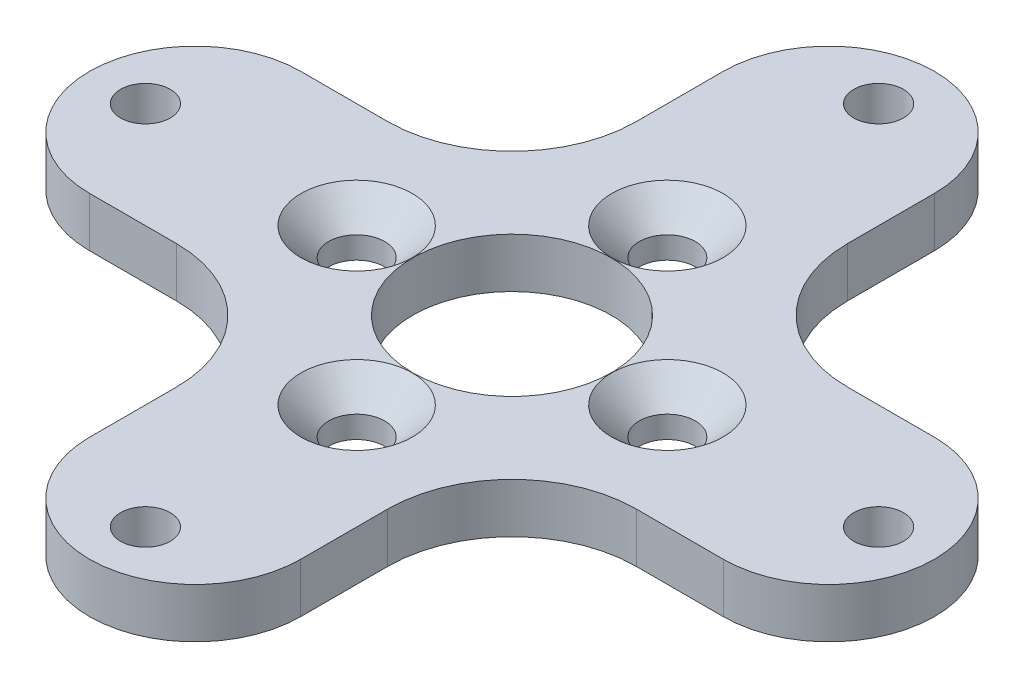
ISO-10303-21;
HEADER;
FILE_DESCRIPTION(('STEP AP214'),'2;1');
FILE_NAME('part.step','',(''),(''),'','','');
FILE_SCHEMA(('AUTOMOTIVE_DESIGN { 1 0 10303 214 1 1 1 1 }'));
ENDSEC;
DATA;
#1=APPLICATION_CONTEXT('core data for automotive mechanical design processes');
#2=APPLICATION_PROTOCOL_DEFINITION('international standard','automotive_design',2000,#1);
#3=PRODUCT_CONTEXT('',#1,'mechanical');
#4=PRODUCT('Part','Part','',(#3));
#5=PRODUCT_RELATED_PRODUCT_CATEGORY('part','',(#4));
#6=PRODUCT_DEFINITION_FORMATION('','',#4);
#7=PRODUCT_DEFINITION_CONTEXT('part definition',#1,'design');
#8=PRODUCT_DEFINITION('design','',#6,#7);
#9=PRODUCT_DEFINITION_SHAPE('','',#8);
#10=(LENGTH_UNIT() NAMED_UNIT(*) SI_UNIT(.MILLI.,.METRE.));
#11=(NAMED_UNIT(*) PLANE_ANGLE_UNIT() SI_UNIT($,.RADIAN.));
#12=(NAMED_UNIT(*) SI_UNIT($,.STERADIAN.) SOLID_ANGLE_UNIT());
#13=UNCERTAINTY_MEASURE_WITH_UNIT(LENGTH_MEASURE(1.E-05),#10,'distance_accuracy_value','');
#14=(GEOMETRIC_REPRESENTATION_CONTEXT(3) GLOBAL_UNCERTAINTY_ASSIGNED_CONTEXT((#13)) GLOBAL_UNIT_ASSIGNED_CONTEXT((#10,
#11,#12)) REPRESENTATION_CONTEXT('',''));
#15=CARTESIAN_POINT('',(0.,0.,0.));
#16=DIRECTION('',(0.,0.,1.));
#17=DIRECTION('',(1.,0.,0.));
#18=AXIS2_PLACEMENT_3D('',#15,#16,#17);
#19=CARTESIAN_POINT('',(0.,2.,-8.50000000000003));
#20=DIRECTION('',(0.,0.,-1.));
#21=DIRECTION('',(-1.,0.,0.));
#22=AXIS2_PLACEMENT_3D('',#19,#20,#21);
#23=PLANE('',#22);
#24=DIRECTION('',(1.,0.,0.));
#25=VECTOR('',#24,1.);
#26=CARTESIAN_POINT('',(0.,2.,-8.50000000000003));
#27=LINE('',#26,#25);
#28=CARTESIAN_POINT('',(-25.5000000000001,2.,-8.50000000000002));
#29=VERTEX_POINT('',#28);
#30=CARTESIAN_POINT('',(-18.5,2.,-8.50000000000002));
#31=VERTEX_POINT('',#30);
#32=EDGE_CURVE('E164',#29,#31,#27,.T.);
#33=ORIENTED_EDGE('',*,*,#32,.T.);
#34=DIRECTION('',(0.,-1.,0.));
#35=VECTOR('',#34,1.);
#36=CARTESIAN_POINT('',(-18.5,2.,-8.50000000000002));
#37=LINE('',#36,#35);
#38=CARTESIAN_POINT('',(-18.5,-2.,-8.50000000000002));
#39=VERTEX_POINT('',#38);
#40=EDGE_CURVE('E170',#31,#39,#37,.T.);
#41=ORIENTED_EDGE('',*,*,#40,.T.);
#42=DIRECTION('',(1.,0.,0.));
#43=VECTOR('',#42,1.);
#44=CARTESIAN_POINT('',(0.,-2.,-8.50000000000003));
#45=LINE('',#44,#43);
#46=CARTESIAN_POINT('',(-25.5000000000001,-2.,-8.50000000000002));
#47=VERTEX_POINT('',#46);
#48=EDGE_CURVE('E167',#47,#39,#45,.T.);
#49=ORIENTED_EDGE('',*,*,#48,.F.);
#50=DIRECTION('',(0.,-1.,0.));
#51=VECTOR('',#50,1.);
#52=CARTESIAN_POINT('',(-25.5000000000001,2.,-8.50000000000002));
#53=LINE('',#52,#51);
#54=EDGE_CURVE('E160',#29,#47,#53,.T.);
#55=ORIENTED_EDGE('',*,*,#54,.F.);
#56=EDGE_LOOP('',(#33,#41,#49,#55));
#57=FACE_BOUND('',#56,.T.);
#58=ADVANCED_FACE('F47',(#57),#23,.T.);
#59=CARTESIAN_POINT('',(-25.5000000000001,2.,0.));
#60=DIRECTION('',(0.,-1.,0.));
#61=DIRECTION('',(0.,0.,-1.));
#62=AXIS2_PLACEMENT_3D('',#59,#60,#61);
#63=CYLINDRICAL_SURFACE('',#62,8.5);
#64=CARTESIAN_POINT('',(-25.5000000000001,-2.,0.));
#65=DIRECTION('',(0.,1.,0.));
#66=DIRECTION('',(0.,0.,1.));
#67=AXIS2_PLACEMENT_3D('',#64,#65,#66);
#68=CIRCLE('',#67,8.5);
#69=CARTESIAN_POINT('',(-25.5000000000001,-2.,8.50000000000002));
#70=VERTEX_POINT('',#69);
#71=EDGE_CURVE('E217',#47,#70,#68,.T.);
#72=ORIENTED_EDGE('',*,*,#71,.T.);
#73=DIRECTION('',(0.,-1.,0.));
#74=VECTOR('',#73,1.);
#75=CARTESIAN_POINT('',(-25.5000000000001,2.,8.50000000000002));
#76=LINE('',#75,#74);
#77=CARTESIAN_POINT('',(-25.5000000000001,2.,8.50000000000002));
#78=VERTEX_POINT('',#77);
#79=EDGE_CURVE('E171',#78,#70,#76,.T.);
#80=ORIENTED_EDGE('',*,*,#79,.F.);
#81=CARTESIAN_POINT('',(-25.5000000000001,2.,0.));
#82=DIRECTION('',(0.,1.,0.));
#83=DIRECTION('',(0.,0.,1.));
#84=AXIS2_PLACEMENT_3D('',#81,#82,#83);
#85=CIRCLE('',#84,8.5);
#86=EDGE_CURVE('E174',#29,#78,#85,.T.);
#87=ORIENTED_EDGE('',*,*,#86,.F.);
#88=ORIENTED_EDGE('',*,*,#54,.T.);
#89=EDGE_LOOP('',(#72,#80,#87,#88));
#90=FACE_BOUND('',#89,.T.);
#91=ADVANCED_FACE('F175',(#90),#63,.T.);
#92=CARTESIAN_POINT('',(0.,2.,8.50000000000002));
#93=DIRECTION('',(0.,0.,-1.));
#94=DIRECTION('',(-1.,0.,0.));
#95=AXIS2_PLACEMENT_3D('',#92,#93,#94);
#96=PLANE('',#95);
#97=DIRECTION('',(1.,0.,0.));
#98=VECTOR('',#97,1.);
#99=CARTESIAN_POINT('',(0.,-2.,8.50000000000002));
#100=LINE('',#99,#98);
#101=CARTESIAN_POINT('',(-18.5,-2.,8.50000000000002));
#102=VERTEX_POINT('',#101);
#103=EDGE_CURVE('E220',#70,#102,#100,.T.);
#104=ORIENTED_EDGE('',*,*,#103,.T.);
#105=DIRECTION('',(0.,-1.,0.));
#106=VECTOR('',#105,1.);
#107=CARTESIAN_POINT('',(-18.5,2.,8.50000000000002));
#108=LINE('',#107,#106);
#109=CARTESIAN_POINT('',(-18.5,2.,8.50000000000002));
#110=VERTEX_POINT('',#109);
#111=EDGE_CURVE('E62',#102,#110,#108,.F.);
#112=ORIENTED_EDGE('',*,*,#111,.T.);
#113=DIRECTION('',(1.,0.,0.));
#114=VECTOR('',#113,1.);
#115=CARTESIAN_POINT('',(0.,2.,8.50000000000002));
#116=LINE('',#115,#114);
#117=EDGE_CURVE('E178',#78,#110,#116,.T.);
#118=ORIENTED_EDGE('',*,*,#117,.F.);
#119=ORIENTED_EDGE('',*,*,#79,.T.);
#120=EDGE_LOOP('',(#104,#112,#118,#119));
#121=FACE_BOUND('',#120,.T.);
#122=ADVANCED_FACE('F313',(#121),#96,.F.);
#123=CARTESIAN_POINT('',(-8.50000000000002,2.,0.));
#124=DIRECTION('',(1.,0.,0.));
#125=DIRECTION('',(0.,0.,-1.));
#126=AXIS2_PLACEMENT_3D('',#123,#124,#125);
#127=PLANE('',#126);
#128=DIRECTION('',(0.,0.,1.));
#129=VECTOR('',#128,1.);
#130=CARTESIAN_POINT('',(-8.50000000000002,2.,0.));
#131=LINE('',#130,#129);
#132=CARTESIAN_POINT('',(-8.50000000000002,2.,18.5));
#133=VERTEX_POINT('',#132);
#134=CARTESIAN_POINT('',(-8.50000000000002,2.,25.5000000000001));
#135=VERTEX_POINT('',#134);
#136=EDGE_CURVE('E194',#133,#135,#131,.T.);
#137=ORIENTED_EDGE('',*,*,#136,.F.);
#138=DIRECTION('',(0.,-1.,0.));
#139=VECTOR('',#138,1.);
#140=CARTESIAN_POINT('',(-8.50000000000002,-2.,18.5));
#141=LINE('',#140,#139);
#142=CARTESIAN_POINT('',(-8.50000000000002,-2.,18.5));
#143=VERTEX_POINT('',#142);
#144=EDGE_CURVE('E270',#133,#143,#141,.T.);
#145=ORIENTED_EDGE('',*,*,#144,.T.);
#146=DIRECTION('',(0.,0.,1.));
#147=VECTOR('',#146,1.);
#148=CARTESIAN_POINT('',(-8.50000000000002,-2.,0.));
#149=LINE('',#148,#147);
#150=CARTESIAN_POINT('',(-8.50000000000002,-2.,25.5000000000001));
#151=VERTEX_POINT('',#150);
#152=EDGE_CURVE('E222',#143,#151,#149,.T.);
#153=ORIENTED_EDGE('',*,*,#152,.T.);
#154=DIRECTION('',(0.,-1.,0.));
#155=VECTOR('',#154,1.);
#156=CARTESIAN_POINT('',(-8.50000000000002,2.,25.5000000000001));
#157=LINE('',#156,#155);
#158=EDGE_CURVE('E253',#135,#151,#157,.T.);
#159=ORIENTED_EDGE('',*,*,#158,.F.);
#160=EDGE_LOOP('',(#137,#145,#153,#159));
#161=FACE_BOUND('',#160,.T.);
#162=ADVANCED_FACE('F309',(#161),#127,.F.);
#163=CARTESIAN_POINT('',(0.,2.,25.5000000000001));
#164=DIRECTION('',(0.,-1.,0.));
#165=DIRECTION('',(0.,0.,-1.));
#166=AXIS2_PLACEMENT_3D('',#163,#164,#165);
#167=CYLINDRICAL_SURFACE('',#166,8.5);
#168=CARTESIAN_POINT('',(0.,-2.,25.5000000000001));
#169=DIRECTION('',(0.,1.,0.));
#170=DIRECTION('',(0.,0.,1.));
#171=AXIS2_PLACEMENT_3D('',#168,#169,#170);
#172=CIRCLE('',#171,8.5);
#173=CARTESIAN_POINT('',(8.50000000000002,-2.,25.5000000000001));
#174=VERTEX_POINT('',#173);
#175=EDGE_CURVE('E224',#151,#174,#172,.T.);
#176=ORIENTED_EDGE('',*,*,#175,.T.);
#177=DIRECTION('',(0.,-1.,0.));
#178=VECTOR('',#177,1.);
#179=CARTESIAN_POINT('',(8.50000000000002,2.,25.5000000000001));
#180=LINE('',#179,#178);
#181=CARTESIAN_POINT('',(8.50000000000002,2.,25.5000000000001));
#182=VERTEX_POINT('',#181);
#183=EDGE_CURVE('E250',#182,#174,#180,.T.);
#184=ORIENTED_EDGE('',*,*,#183,.F.);
#185=CARTESIAN_POINT('',(0.,2.,25.5000000000001));
#186=DIRECTION('',(0.,1.,0.));
#187=DIRECTION('',(0.,0.,1.));
#188=AXIS2_PLACEMENT_3D('',#185,#186,#187);
#189=CIRCLE('',#188,8.5);
#190=EDGE_CURVE('E196',#135,#182,#189,.T.);
#191=ORIENTED_EDGE('',*,*,#190,.F.);
#192=ORIENTED_EDGE('',*,*,#158,.T.);
#193=EDGE_LOOP('',(#176,#184,#191,#192));
#194=FACE_BOUND('',#193,.T.);
#195=ADVANCED_FACE('F305',(#194),#167,.T.);
#196=CARTESIAN_POINT('',(8.50000000000002,2.,0.));
#197=DIRECTION('',(1.,0.,0.));
#198=DIRECTION('',(0.,0.,-1.));
#199=AXIS2_PLACEMENT_3D('',#196,#197,#198);
#200=PLANE('',#199);
#201=DIRECTION('',(0.,0.,1.));
#202=VECTOR('',#201,1.);
#203=CARTESIAN_POINT('',(8.50000000000002,-2.,0.));
#204=LINE('',#203,#202);
#205=CARTESIAN_POINT('',(8.50000000000002,-2.,18.5));
#206=VERTEX_POINT('',#205);
#207=EDGE_CURVE('E227',#206,#174,#204,.T.);
#208=ORIENTED_EDGE('',*,*,#207,.F.);
#209=DIRECTION('',(0.,-1.,0.));
#210=VECTOR('',#209,1.);
#211=CARTESIAN_POINT('',(8.50000000000002,2.,18.5));
#212=LINE('',#211,#210);
#213=CARTESIAN_POINT('',(8.50000000000002,2.,18.5));
#214=VERTEX_POINT('',#213);
#215=EDGE_CURVE('E268',#206,#214,#212,.F.);
#216=ORIENTED_EDGE('',*,*,#215,.T.);
#217=DIRECTION('',(0.,0.,1.));
#218=VECTOR('',#217,1.);
#219=CARTESIAN_POINT('',(8.50000000000002,2.,0.));
#220=LINE('',#219,#218);
#221=EDGE_CURVE('E199',#214,#182,#220,.T.);
#222=ORIENTED_EDGE('',*,*,#221,.T.);
#223=ORIENTED_EDGE('',*,*,#183,.T.);
#224=EDGE_LOOP('',(#208,#216,#222,#223));
#225=FACE_BOUND('',#224,.T.);
#226=ADVANCED_FACE('F301',(#225),#200,.T.);
#227=CARTESIAN_POINT('',(0.,2.,8.50000000000002));
#228=DIRECTION('',(0.,0.,-1.));
#229=DIRECTION('',(-1.,0.,0.));
#230=AXIS2_PLACEMENT_3D('',#227,#228,#229);
#231=PLANE('',#230);
#232=DIRECTION('',(1.,0.,0.));
#233=VECTOR('',#232,1.);
#234=CARTESIAN_POINT('',(0.,2.,8.50000000000002));
#235=LINE('',#234,#233);
#236=CARTESIAN_POINT('',(18.5,2.,8.50000000000002));
#237=VERTEX_POINT('',#236);
#238=CARTESIAN_POINT('',(25.5000000000001,2.,8.50000000000002));
#239=VERTEX_POINT('',#238);
#240=EDGE_CURVE('E201',#237,#239,#235,.T.);
#241=ORIENTED_EDGE('',*,*,#240,.F.);
#242=DIRECTION('',(0.,-1.,0.));
#243=VECTOR('',#242,1.);
#244=CARTESIAN_POINT('',(18.5,2.,8.50000000000002));
#245=LINE('',#244,#243);
#246=CARTESIAN_POINT('',(18.5,-2.,8.50000000000002));
#247=VERTEX_POINT('',#246);
#248=EDGE_CURVE('E265',#237,#247,#245,.T.);
#249=ORIENTED_EDGE('',*,*,#248,.T.);
#250=DIRECTION('',(1.,0.,0.));
#251=VECTOR('',#250,1.);
#252=CARTESIAN_POINT('',(0.,-2.,8.50000000000002));
#253=LINE('',#252,#251);
#254=CARTESIAN_POINT('',(25.5000000000001,-2.,8.50000000000002));
#255=VERTEX_POINT('',#254);
#256=EDGE_CURVE('E229',#247,#255,#253,.T.);
#257=ORIENTED_EDGE('',*,*,#256,.T.);
#258=DIRECTION('',(0.,-1.,0.));
#259=VECTOR('',#258,1.);
#260=CARTESIAN_POINT('',(25.5000000000001,2.,8.50000000000002));
#261=LINE('',#260,#259);
#262=EDGE_CURVE('E247',#239,#255,#261,.T.);
#263=ORIENTED_EDGE('',*,*,#262,.F.);
#264=EDGE_LOOP('',(#241,#249,#257,#263));
#265=FACE_BOUND('',#264,.T.);
#266=ADVANCED_FACE('F292',(#265),#231,.F.);
#267=CARTESIAN_POINT('',(25.5000000000001,2.,0.));
#268=DIRECTION('',(0.,-1.,0.));
#269=DIRECTION('',(0.,0.,-1.));
#270=AXIS2_PLACEMENT_3D('',#267,#268,#269);
#271=CYLINDRICAL_SURFACE('',#270,8.5);
#272=CARTESIAN_POINT('',(25.5000000000001,-2.,0.));
#273=DIRECTION('',(0.,1.,0.));
#274=DIRECTION('',(0.,0.,1.));
#275=AXIS2_PLACEMENT_3D('',#272,#273,#274);
#276=CIRCLE('',#275,8.5);
#277=CARTESIAN_POINT('',(25.5000000000001,-2.,-8.50000000000003));
#278=VERTEX_POINT('',#277);
#279=EDGE_CURVE('E231',#255,#278,#276,.T.);
#280=ORIENTED_EDGE('',*,*,#279,.T.);
#281=DIRECTION('',(0.,-1.,0.));
#282=VECTOR('',#281,1.);
#283=CARTESIAN_POINT('',(25.5000000000001,2.,-8.50000000000003));
#284=LINE('',#283,#282);
#285=CARTESIAN_POINT('',(25.5000000000001,2.,-8.50000000000003));
#286=VERTEX_POINT('',#285);
#287=EDGE_CURVE('E244',#286,#278,#284,.T.);
#288=ORIENTED_EDGE('',*,*,#287,.F.);
#289=CARTESIAN_POINT('',(25.5000000000001,2.,0.));
#290=DIRECTION('',(0.,1.,0.));
#291=DIRECTION('',(0.,0.,1.));
#292=AXIS2_PLACEMENT_3D('',#289,#290,#291);
#293=CIRCLE('',#292,8.5);
#294=EDGE_CURVE('E203',#239,#286,#293,.T.);
#295=ORIENTED_EDGE('',*,*,#294,.F.);
#296=ORIENTED_EDGE('',*,*,#262,.T.);
#297=EDGE_LOOP('',(#280,#288,#295,#296));
#298=FACE_BOUND('',#297,.T.);
#299=ADVANCED_FACE('F351',(#298),#271,.T.);
#300=CARTESIAN_POINT('',(0.,2.,-8.50000000000003));
#301=DIRECTION('',(0.,0.,-1.));
#302=DIRECTION('',(-1.,0.,0.));
#303=AXIS2_PLACEMENT_3D('',#300,#301,#302);
#304=PLANE('',#303);
#305=DIRECTION('',(1.,0.,0.));
#306=VECTOR('',#305,1.);
#307=CARTESIAN_POINT('',(0.,-2.,-8.50000000000003));
#308=LINE('',#307,#306);
#309=CARTESIAN_POINT('',(18.5,-2.,-8.50000000000003));
#310=VERTEX_POINT('',#309);
#311=EDGE_CURVE('E234',#310,#278,#308,.T.);
#312=ORIENTED_EDGE('',*,*,#311,.F.);
#313=DIRECTION('',(0.,-1.,0.));
#314=VECTOR('',#313,1.);
#315=CARTESIAN_POINT('',(18.5,2.,-8.50000000000003));
#316=LINE('',#315,#314);
#317=CARTESIAN_POINT('',(18.5,2.,-8.50000000000003));
#318=VERTEX_POINT('',#317);
#319=EDGE_CURVE('E263',#310,#318,#316,.F.);
#320=ORIENTED_EDGE('',*,*,#319,.T.);
#321=DIRECTION('',(1.,0.,0.));
#322=VECTOR('',#321,1.);
#323=CARTESIAN_POINT('',(0.,2.,-8.50000000000003));
#324=LINE('',#323,#322);
#325=EDGE_CURVE('E206',#318,#286,#324,.T.);
#326=ORIENTED_EDGE('',*,*,#325,.T.);
#327=ORIENTED_EDGE('',*,*,#287,.T.);
#328=EDGE_LOOP('',(#312,#320,#326,#327));
#329=FACE_BOUND('',#328,.T.);
#330=ADVANCED_FACE('F354',(#329),#304,.T.);
#331=CARTESIAN_POINT('',(8.50000000000002,2.,0.));
#332=DIRECTION('',(1.,0.,0.));
#333=DIRECTION('',(0.,0.,-1.));
#334=AXIS2_PLACEMENT_3D('',#331,#332,#333);
#335=PLANE('',#334);
#336=DIRECTION('',(0.,0.,1.));
#337=VECTOR('',#336,1.);
#338=CARTESIAN_POINT('',(8.50000000000002,2.,0.));
#339=LINE('',#338,#337);
#340=CARTESIAN_POINT('',(8.50000000000002,2.,-25.5000000000001));
#341=VERTEX_POINT('',#340);
#342=CARTESIAN_POINT('',(8.50000000000002,2.,-18.5000000000001));
#343=VERTEX_POINT('',#342);
#344=EDGE_CURVE('E208',#341,#343,#339,.T.);
#345=ORIENTED_EDGE('',*,*,#344,.T.);
#346=DIRECTION('',(0.,-1.,0.));
#347=VECTOR('',#346,1.);
#348=CARTESIAN_POINT('',(8.50000000000002,-2.,-18.5000000000001));
#349=LINE('',#348,#347);
#350=CARTESIAN_POINT('',(8.50000000000002,-2.,-18.5000000000001));
#351=VERTEX_POINT('',#350);
#352=EDGE_CURVE('E260',#343,#351,#349,.T.);
#353=ORIENTED_EDGE('',*,*,#352,.T.);
#354=DIRECTION('',(0.,0.,1.));
#355=VECTOR('',#354,1.);
#356=CARTESIAN_POINT('',(8.50000000000002,-2.,0.));
#357=LINE('',#356,#355);
#358=CARTESIAN_POINT('',(8.50000000000002,-2.,-25.5000000000001));
#359=VERTEX_POINT('',#358);
#360=EDGE_CURVE('E236',#359,#351,#357,.T.);
#361=ORIENTED_EDGE('',*,*,#360,.F.);
#362=DIRECTION('',(0.,-1.,0.));
#363=VECTOR('',#362,1.);
#364=CARTESIAN_POINT('',(8.50000000000002,2.,-25.5000000000001));
#365=LINE('',#364,#363);
#366=EDGE_CURVE('E242',#341,#359,#365,.T.);
#367=ORIENTED_EDGE('',*,*,#366,.F.);
#368=EDGE_LOOP('',(#345,#353,#361,#367));
#369=FACE_BOUND('',#368,.T.);
#370=ADVANCED_FACE('F358',(#369),#335,.T.);
#371=CARTESIAN_POINT('',(0.,2.,-25.5000000000001));
#372=DIRECTION('',(0.,-1.,0.));
#373=DIRECTION('',(0.,0.,-1.));
#374=AXIS2_PLACEMENT_3D('',#371,#372,#373);
#375=CYLINDRICAL_SURFACE('',#374,8.5);
#376=CARTESIAN_POINT('',(0.,-2.,-25.5000000000001));
#377=DIRECTION('',(0.,1.,0.));
#378=DIRECTION('',(0.,0.,1.));
#379=AXIS2_PLACEMENT_3D('',#376,#377,#378);
#380=CIRCLE('',#379,8.5);
#381=CARTESIAN_POINT('',(-8.50000000000002,-2.,-25.5000000000001));
#382=VERTEX_POINT('',#381);
#383=EDGE_CURVE('E187',#359,#382,#380,.T.);
#384=ORIENTED_EDGE('',*,*,#383,.T.);
#385=DIRECTION('',(0.,-1.,0.));
#386=VECTOR('',#385,1.);
#387=CARTESIAN_POINT('',(-8.50000000000002,2.,-25.5000000000001));
#388=LINE('',#387,#386);
#389=CARTESIAN_POINT('',(-8.50000000000002,2.,-25.5000000000001));
#390=VERTEX_POINT('',#389);
#391=EDGE_CURVE('E215',#390,#382,#388,.T.);
#392=ORIENTED_EDGE('',*,*,#391,.F.);
#393=CARTESIAN_POINT('',(0.,2.,-25.5000000000001));
#394=DIRECTION('',(0.,1.,0.));
#395=DIRECTION('',(0.,0.,1.));
#396=AXIS2_PLACEMENT_3D('',#393,#394,#395);
#397=CIRCLE('',#396,8.5);
#398=EDGE_CURVE('E211',#341,#390,#397,.T.);
#399=ORIENTED_EDGE('',*,*,#398,.F.);
#400=ORIENTED_EDGE('',*,*,#366,.T.);
#401=EDGE_LOOP('',(#384,#392,#399,#400));
#402=FACE_BOUND('',#401,.T.);
#403=ADVANCED_FACE('F362',(#402),#375,.T.);
#404=CARTESIAN_POINT('',(-8.50000000000002,2.,0.));
#405=DIRECTION('',(1.,0.,0.));
#406=DIRECTION('',(0.,0.,-1.));
#407=AXIS2_PLACEMENT_3D('',#404,#405,#406);
#408=PLANE('',#407);
#409=DIRECTION('',(0.,0.,1.));
#410=VECTOR('',#409,1.);
#411=CARTESIAN_POINT('',(-8.50000000000002,-2.,0.));
#412=LINE('',#411,#410);
#413=CARTESIAN_POINT('',(-8.50000000000002,-2.,-18.5));
#414=VERTEX_POINT('',#413);
#415=EDGE_CURVE('E184',#382,#414,#412,.T.);
#416=ORIENTED_EDGE('',*,*,#415,.T.);
#417=DIRECTION('',(0.,-1.,0.));
#418=VECTOR('',#417,1.);
#419=CARTESIAN_POINT('',(-8.50000000000002,2.,-18.5));
#420=LINE('',#419,#418);
#421=CARTESIAN_POINT('',(-8.50000000000002,2.,-18.5));
#422=VERTEX_POINT('',#421);
#423=EDGE_CURVE('E258',#414,#422,#420,.F.);
#424=ORIENTED_EDGE('',*,*,#423,.T.);
#425=DIRECTION('',(0.,0.,1.));
#426=VECTOR('',#425,1.);
#427=CARTESIAN_POINT('',(-8.50000000000002,2.,0.));
#428=LINE('',#427,#426);
#429=EDGE_CURVE('E213',#390,#422,#428,.T.);
#430=ORIENTED_EDGE('',*,*,#429,.F.);
#431=ORIENTED_EDGE('',*,*,#391,.T.);
#432=EDGE_LOOP('',(#416,#424,#430,#431));
#433=FACE_BOUND('',#432,.T.);
#434=ADVANCED_FACE('F319',(#433),#408,.F.);
#435=CARTESIAN_POINT('',(0.,2.,0.));
#436=DIRECTION('',(0.,1.,0.));
#437=DIRECTION('',(0.,0.,1.));
#438=AXIS2_PLACEMENT_3D('',#435,#436,#437);
#439=PLANE('',#438);
#440=CARTESIAN_POINT('',(-12.5,2.,0.));
#441=DIRECTION('',(0.,1.,0.));
#442=DIRECTION('',(0.,0.,1.));
#443=AXIS2_PLACEMENT_3D('',#440,#441,#442);
#444=CIRCLE('',#443,4.48);
#445=CARTESIAN_POINT('',(-12.5,2.,4.48000000000002));
#446=VERTEX_POINT('',#445);
#447=EDGE_CURVE('E431',#446,#446,#444,.T.);
#448=ORIENTED_EDGE('',*,*,#447,.F.);
#449=EDGE_LOOP('',(#448));
#450=FACE_BOUND('',#449,.T.);
#451=CARTESIAN_POINT('',(0.,2.,-12.5));
#452=DIRECTION('',(0.,1.,0.));
#453=DIRECTION('',(0.,0.,1.));
#454=AXIS2_PLACEMENT_3D('',#451,#452,#453);
#455=CIRCLE('',#454,4.48);
#456=CARTESIAN_POINT('',(0.,2.,-8.02000000000003));
#457=VERTEX_POINT('',#456);
#458=EDGE_CURVE('E438',#457,#457,#455,.T.);
#459=ORIENTED_EDGE('',*,*,#458,.F.);
#460=EDGE_LOOP('',(#459));
#461=FACE_BOUND('',#460,.T.);
#462=CARTESIAN_POINT('',(12.5,2.,0.));
#463=DIRECTION('',(0.,1.,0.));
#464=DIRECTION('',(0.,0.,1.));
#465=AXIS2_PLACEMENT_3D('',#462,#463,#464);
#466=CIRCLE('',#465,4.48);
#467=CARTESIAN_POINT('',(12.5,2.,4.48000000000002));
#468=VERTEX_POINT('',#467);
#469=EDGE_CURVE('E447',#468,#468,#466,.T.);
#470=ORIENTED_EDGE('',*,*,#469,.F.);
#471=EDGE_LOOP('',(#470));
#472=FACE_BOUND('',#471,.T.);
#473=CARTESIAN_POINT('',(0.,2.,12.5));
#474=DIRECTION('',(0.,1.,0.));
#475=DIRECTION('',(0.,0.,1.));
#476=AXIS2_PLACEMENT_3D('',#473,#474,#475);
#477=CIRCLE('',#476,4.48);
#478=CARTESIAN_POINT('',(0.,2.,16.9800000000001));
#479=VERTEX_POINT('',#478);
#480=EDGE_CURVE('E456',#479,#479,#477,.T.);
#481=ORIENTED_EDGE('',*,*,#480,.F.);
#482=EDGE_LOOP('',(#481));
#483=FACE_BOUND('',#482,.T.);
#484=CARTESIAN_POINT('',(29.5000000000001,2.,-3.06503954161652E-13));
#485=DIRECTION('',(0.,1.,0.));
#486=DIRECTION('',(-1.,0.,0.));
#487=AXIS2_PLACEMENT_3D('',#484,#485,#486);
#488=CIRCLE('',#487,2.);
#489=CARTESIAN_POINT('',(27.5000000000001,2.,-2.85555066128593E-13));
#490=VERTEX_POINT('',#489);
#491=EDGE_CURVE('E465',#490,#490,#488,.T.);
#492=ORIENTED_EDGE('',*,*,#491,.F.);
#493=EDGE_LOOP('',(#492));
#494=FACE_BOUND('',#493,.T.);
#495=CARTESIAN_POINT('',(-29.5000000000001,2.,1.00505541389406E-13));
#496=DIRECTION('',(0.,1.,0.));
#497=DIRECTION('',(1.,0.,0.));
#498=AXIS2_PLACEMENT_3D('',#495,#496,#497);
#499=CIRCLE('',#498,2.);
#500=CARTESIAN_POINT('',(-27.5000000000001,2.,0.));
#501=VERTEX_POINT('',#500);
#502=EDGE_CURVE('E469',#501,#501,#499,.T.);
#503=ORIENTED_EDGE('',*,*,#502,.F.);
#504=EDGE_LOOP('',(#503));
#505=FACE_BOUND('',#504,.T.);
#506=CARTESIAN_POINT('',(0.,2.,29.5000000000001));
#507=DIRECTION('',(0.,1.,0.));
#508=DIRECTION('',(0.,0.,-1.));
#509=AXIS2_PLACEMENT_3D('',#506,#507,#508);
#510=CIRCLE('',#509,2.);
#511=CARTESIAN_POINT('',(0.,2.,27.5000000000001));
#512=VERTEX_POINT('',#511);
#513=EDGE_CURVE('E470',#512,#512,#510,.T.);
#514=ORIENTED_EDGE('',*,*,#513,.F.);
#515=EDGE_LOOP('',(#514));
#516=FACE_BOUND('',#515,.T.);
#517=CARTESIAN_POINT('',(0.,2.,0.));
#518=DIRECTION('',(0.,1.,0.));
#519=DIRECTION('',(0.,0.,1.));
#520=AXIS2_PLACEMENT_3D('',#517,#518,#519);
#521=CIRCLE('',#520,8.);
#522=CARTESIAN_POINT('',(0.,2.,8.00000000000002));
#523=VERTEX_POINT('',#522);
#524=EDGE_CURVE('E485',#523,#523,#521,.T.);
#525=ORIENTED_EDGE('',*,*,#524,.F.);
#526=EDGE_LOOP('',(#525));
#527=FACE_BOUND('',#526,.T.);
#528=CARTESIAN_POINT('',(0.,2.,-29.5000000000001));
#529=DIRECTION('',(0.,1.,0.));
#530=DIRECTION('',(0.,0.,1.));
#531=AXIS2_PLACEMENT_3D('',#528,#529,#530);
#532=CIRCLE('',#531,2.);
#533=CARTESIAN_POINT('',(0.,2.,-27.5000000000001));
#534=VERTEX_POINT('',#533);
#535=EDGE_CURVE('E190',#534,#534,#532,.T.);
#536=ORIENTED_EDGE('',*,*,#535,.F.);
#537=EDGE_LOOP('',(#536));
#538=FACE_BOUND('',#537,.T.);
#539=ORIENTED_EDGE('',*,*,#32,.F.);
#540=ORIENTED_EDGE('',*,*,#86,.T.);
#541=ORIENTED_EDGE('',*,*,#117,.T.);
#542=CARTESIAN_POINT('',(-18.5,2.,18.5));
#543=DIRECTION('',(0.,1.,0.));
#544=DIRECTION('',(0.,0.,1.));
#545=AXIS2_PLACEMENT_3D('',#542,#543,#544);
#546=CIRCLE('',#545,10.);
#547=EDGE_CURVE('E13',#110,#133,#546,.F.);
#548=ORIENTED_EDGE('',*,*,#547,.T.);
#549=ORIENTED_EDGE('',*,*,#136,.T.);
#550=ORIENTED_EDGE('',*,*,#190,.T.);
#551=ORIENTED_EDGE('',*,*,#221,.F.);
#552=CARTESIAN_POINT('',(18.5,2.,18.5));
#553=DIRECTION('',(0.,1.,0.));
#554=DIRECTION('',(0.,0.,1.));
#555=AXIS2_PLACEMENT_3D('',#552,#553,#554);
#556=CIRCLE('',#555,10.);
#557=EDGE_CURVE('E283',#214,#237,#556,.F.);
#558=ORIENTED_EDGE('',*,*,#557,.T.);
#559=ORIENTED_EDGE('',*,*,#240,.T.);
#560=ORIENTED_EDGE('',*,*,#294,.T.);
#561=ORIENTED_EDGE('',*,*,#325,.F.);
#562=CARTESIAN_POINT('',(18.5,2.,-18.5000000000001));
#563=DIRECTION('',(0.,1.,0.));
#564=DIRECTION('',(0.,0.,1.));
#565=AXIS2_PLACEMENT_3D('',#562,#563,#564);
#566=CIRCLE('',#565,10.);
#567=EDGE_CURVE('E279',#318,#343,#566,.F.);
#568=ORIENTED_EDGE('',*,*,#567,.T.);
#569=ORIENTED_EDGE('',*,*,#344,.F.);
#570=ORIENTED_EDGE('',*,*,#398,.T.);
#571=ORIENTED_EDGE('',*,*,#429,.T.);
#572=CARTESIAN_POINT('',(-18.5,2.,-18.5));
#573=DIRECTION('',(0.,1.,0.));
#574=DIRECTION('',(0.,0.,1.));
#575=AXIS2_PLACEMENT_3D('',#572,#573,#574);
#576=CIRCLE('',#575,10.);
#577=EDGE_CURVE('E183',#422,#31,#576,.F.);
#578=ORIENTED_EDGE('',*,*,#577,.T.);
#579=EDGE_LOOP('',(#539,#540,#541,#548,#549,#550,#551,#558,#559,#560,#561,#568,#569,#570,#571,#578));
#580=FACE_BOUND('',#579,.T.);
#581=ADVANCED_FACE('F180',(#450,#461,#472,#483,#494,#505,#516,#527,#538,#580),#439,.T.);
#582=CARTESIAN_POINT('',(0.,-2.,0.));
#583=DIRECTION('',(0.,1.,0.));
#584=DIRECTION('',(0.,0.,1.));
#585=AXIS2_PLACEMENT_3D('',#582,#583,#584);
#586=PLANE('',#585);
#587=CARTESIAN_POINT('',(-12.5,-2.,0.));
#588=DIRECTION('',(0.,1.,0.));
#589=DIRECTION('',(0.,0.,1.));
#590=AXIS2_PLACEMENT_3D('',#587,#588,#589);
#591=CIRCLE('',#590,2.25);
#592=CARTESIAN_POINT('',(-12.5,-2.,2.25));
#593=VERTEX_POINT('',#592);
#594=EDGE_CURVE('E433',#593,#593,#591,.T.);
#595=ORIENTED_EDGE('',*,*,#594,.T.);
#596=EDGE_LOOP('',(#595));
#597=FACE_BOUND('',#596,.T.);
#598=CARTESIAN_POINT('',(0.,-2.,-12.5));
#599=DIRECTION('',(0.,1.,0.));
#600=DIRECTION('',(0.,0.,1.));
#601=AXIS2_PLACEMENT_3D('',#598,#599,#600);
#602=CIRCLE('',#601,2.25);
#603=CARTESIAN_POINT('',(0.,-2.,-10.25));
#604=VERTEX_POINT('',#603);
#605=EDGE_CURVE('E444',#604,#604,#602,.T.);
#606=ORIENTED_EDGE('',*,*,#605,.T.);
#607=EDGE_LOOP('',(#606));
#608=FACE_BOUND('',#607,.T.);
#609=CARTESIAN_POINT('',(12.5,-2.,0.));
#610=DIRECTION('',(0.,1.,0.));
#611=DIRECTION('',(0.,0.,1.));
#612=AXIS2_PLACEMENT_3D('',#609,#610,#611);
#613=CIRCLE('',#612,2.25);
#614=CARTESIAN_POINT('',(12.5,-2.,2.25));
#615=VERTEX_POINT('',#614);
#616=EDGE_CURVE('E453',#615,#615,#613,.T.);
#617=ORIENTED_EDGE('',*,*,#616,.T.);
#618=EDGE_LOOP('',(#617));
#619=FACE_BOUND('',#618,.T.);
#620=CARTESIAN_POINT('',(0.,-2.,12.5));
#621=DIRECTION('',(0.,1.,0.));
#622=DIRECTION('',(0.,0.,1.));
#623=AXIS2_PLACEMENT_3D('',#620,#621,#622);
#624=CIRCLE('',#623,2.25);
#625=CARTESIAN_POINT('',(0.,-2.,14.7500000000001));
#626=VERTEX_POINT('',#625);
#627=EDGE_CURVE('E462',#626,#626,#624,.T.);
#628=ORIENTED_EDGE('',*,*,#627,.T.);
#629=EDGE_LOOP('',(#628));
#630=FACE_BOUND('',#629,.T.);
#631=CARTESIAN_POINT('',(29.5000000000001,-2.,-3.06503954161652E-13));
#632=DIRECTION('',(0.,1.,0.));
#633=DIRECTION('',(-1.,0.,0.));
#634=AXIS2_PLACEMENT_3D('',#631,#632,#633);
#635=CIRCLE('',#634,2.);
#636=CARTESIAN_POINT('',(27.5000000000001,-2.,-2.85555066128593E-13));
#637=VERTEX_POINT('',#636);
#638=EDGE_CURVE('E473',#637,#637,#635,.T.);
#639=ORIENTED_EDGE('',*,*,#638,.T.);
#640=EDGE_LOOP('',(#639));
#641=FACE_BOUND('',#640,.T.);
#642=CARTESIAN_POINT('',(-29.5000000000001,-2.,1.00505541389406E-13));
#643=DIRECTION('',(0.,1.,0.));
#644=DIRECTION('',(1.,0.,0.));
#645=AXIS2_PLACEMENT_3D('',#642,#643,#644);
#646=CIRCLE('',#645,2.);
#647=CARTESIAN_POINT('',(-27.5000000000001,-2.,0.));
#648=VERTEX_POINT('',#647);
#649=EDGE_CURVE('E474',#648,#648,#646,.T.);
#650=ORIENTED_EDGE('',*,*,#649,.T.);
#651=EDGE_LOOP('',(#650));
#652=FACE_BOUND('',#651,.T.);
#653=CARTESIAN_POINT('',(0.,-2.,29.5000000000001));
#654=DIRECTION('',(0.,1.,0.));
#655=DIRECTION('',(0.,0.,-1.));
#656=AXIS2_PLACEMENT_3D('',#653,#654,#655);
#657=CIRCLE('',#656,2.);
#658=CARTESIAN_POINT('',(0.,-2.,27.5000000000001));
#659=VERTEX_POINT('',#658);
#660=EDGE_CURVE('E466',#659,#659,#657,.T.);
#661=ORIENTED_EDGE('',*,*,#660,.T.);
#662=EDGE_LOOP('',(#661));
#663=FACE_BOUND('',#662,.T.);
#664=CARTESIAN_POINT('',(0.,-2.,0.));
#665=DIRECTION('',(0.,1.,0.));
#666=DIRECTION('',(0.,0.,1.));
#667=AXIS2_PLACEMENT_3D('',#664,#665,#666);
#668=CIRCLE('',#667,8.);
#669=CARTESIAN_POINT('',(0.,-2.,8.00000000000002));
#670=VERTEX_POINT('',#669);
#671=EDGE_CURVE('E218',#670,#670,#668,.T.);
#672=ORIENTED_EDGE('',*,*,#671,.T.);
#673=EDGE_LOOP('',(#672));
#674=FACE_BOUND('',#673,.T.);
#675=CARTESIAN_POINT('',(0.,-2.,-29.5000000000001));
#676=DIRECTION('',(0.,1.,0.));
#677=DIRECTION('',(0.,0.,1.));
#678=AXIS2_PLACEMENT_3D('',#675,#676,#677);
#679=CIRCLE('',#678,2.);
#680=CARTESIAN_POINT('',(0.,-2.,-27.5000000000001));
#681=VERTEX_POINT('',#680);
#682=EDGE_CURVE('E487',#681,#681,#679,.T.);
#683=ORIENTED_EDGE('',*,*,#682,.T.);
#684=EDGE_LOOP('',(#683));
#685=FACE_BOUND('',#684,.T.);
#686=ORIENTED_EDGE('',*,*,#48,.T.);
#687=CARTESIAN_POINT('',(-18.5,-2.,-18.5));
#688=DIRECTION('',(0.,1.,0.));
#689=DIRECTION('',(0.,0.,1.));
#690=AXIS2_PLACEMENT_3D('',#687,#688,#689);
#691=CIRCLE('',#690,10.);
#692=EDGE_CURVE('E274',#39,#414,#691,.T.);
#693=ORIENTED_EDGE('',*,*,#692,.T.);
#694=ORIENTED_EDGE('',*,*,#415,.F.);
#695=ORIENTED_EDGE('',*,*,#383,.F.);
#696=ORIENTED_EDGE('',*,*,#360,.T.);
#697=CARTESIAN_POINT('',(18.5,-2.,-18.5000000000001));
#698=DIRECTION('',(0.,1.,0.));
#699=DIRECTION('',(0.,0.,1.));
#700=AXIS2_PLACEMENT_3D('',#697,#698,#699);
#701=CIRCLE('',#700,10.);
#702=EDGE_CURVE('E277',#351,#310,#701,.T.);
#703=ORIENTED_EDGE('',*,*,#702,.T.);
#704=ORIENTED_EDGE('',*,*,#311,.T.);
#705=ORIENTED_EDGE('',*,*,#279,.F.);
#706=ORIENTED_EDGE('',*,*,#256,.F.);
#707=CARTESIAN_POINT('',(18.5,-2.,18.5));
#708=DIRECTION('',(0.,1.,0.));
#709=DIRECTION('',(0.,0.,1.));
#710=AXIS2_PLACEMENT_3D('',#707,#708,#709);
#711=CIRCLE('',#710,10.);
#712=EDGE_CURVE('E281',#247,#206,#711,.T.);
#713=ORIENTED_EDGE('',*,*,#712,.T.);
#714=ORIENTED_EDGE('',*,*,#207,.T.);
#715=ORIENTED_EDGE('',*,*,#175,.F.);
#716=ORIENTED_EDGE('',*,*,#152,.F.);
#717=CARTESIAN_POINT('',(-18.5,-2.,18.5));
#718=DIRECTION('',(0.,1.,0.));
#719=DIRECTION('',(0.,0.,1.));
#720=AXIS2_PLACEMENT_3D('',#717,#718,#719);
#721=CIRCLE('',#720,10.);
#722=EDGE_CURVE('E55',#143,#102,#721,.T.);
#723=ORIENTED_EDGE('',*,*,#722,.T.);
#724=ORIENTED_EDGE('',*,*,#103,.F.);
#725=ORIENTED_EDGE('',*,*,#71,.F.);
#726=EDGE_LOOP('',(#686,#693,#694,#695,#696,#703,#704,#705,#706,#713,#714,#715,#716,#723,#724,#725));
#727=FACE_BOUND('',#726,.T.);
#728=ADVANCED_FACE('F297',(#597,#608,#619,#630,#641,#652,#663,#674,#685,#727),#586,.F.);
#729=CARTESIAN_POINT('',(-18.5,2.,-18.5));
#730=DIRECTION('',(0.,-1.,0.));
#731=DIRECTION('',(0.,0.,-1.));
#732=AXIS2_PLACEMENT_3D('',#729,#730,#731);
#733=CYLINDRICAL_SURFACE('',#732,10.);
#734=ORIENTED_EDGE('',*,*,#577,.F.);
#735=ORIENTED_EDGE('',*,*,#423,.F.);
#736=ORIENTED_EDGE('',*,*,#692,.F.);
#737=ORIENTED_EDGE('',*,*,#40,.F.);
#738=EDGE_LOOP('',(#734,#735,#736,#737));
#739=FACE_BOUND('',#738,.T.);
#740=ADVANCED_FACE('F322',(#739),#733,.F.);
#741=CARTESIAN_POINT('',(18.5,2.,-18.5000000000001));
#742=DIRECTION('',(0.,1.,0.));
#743=DIRECTION('',(0.,0.,1.));
#744=AXIS2_PLACEMENT_3D('',#741,#742,#743);
#745=CYLINDRICAL_SURFACE('',#744,10.);
#746=ORIENTED_EDGE('',*,*,#567,.F.);
#747=ORIENTED_EDGE('',*,*,#319,.F.);
#748=ORIENTED_EDGE('',*,*,#702,.F.);
#749=ORIENTED_EDGE('',*,*,#352,.F.);
#750=EDGE_LOOP('',(#746,#747,#748,#749));
#751=FACE_BOUND('',#750,.T.);
#752=ADVANCED_FACE('F324',(#751),#745,.F.);
#753=CARTESIAN_POINT('',(18.5,2.,18.5));
#754=DIRECTION('',(0.,-1.,0.));
#755=DIRECTION('',(0.,0.,-1.));
#756=AXIS2_PLACEMENT_3D('',#753,#754,#755);
#757=CYLINDRICAL_SURFACE('',#756,10.);
#758=ORIENTED_EDGE('',*,*,#557,.F.);
#759=ORIENTED_EDGE('',*,*,#215,.F.);
#760=ORIENTED_EDGE('',*,*,#712,.F.);
#761=ORIENTED_EDGE('',*,*,#248,.F.);
#762=EDGE_LOOP('',(#758,#759,#760,#761));
#763=FACE_BOUND('',#762,.T.);
#764=ADVANCED_FACE('F295',(#763),#757,.F.);
#765=CARTESIAN_POINT('',(-18.5,2.,18.5));
#766=DIRECTION('',(0.,1.,0.));
#767=DIRECTION('',(0.,0.,1.));
#768=AXIS2_PLACEMENT_3D('',#765,#766,#767);
#769=CYLINDRICAL_SURFACE('',#768,10.);
#770=ORIENTED_EDGE('',*,*,#547,.F.);
#771=ORIENTED_EDGE('',*,*,#111,.F.);
#772=ORIENTED_EDGE('',*,*,#722,.F.);
#773=ORIENTED_EDGE('',*,*,#144,.F.);
#774=EDGE_LOOP('',(#770,#771,#772,#773));
#775=FACE_BOUND('',#774,.T.);
#776=ADVANCED_FACE('F49',(#775),#769,.F.);
#777=CARTESIAN_POINT('',(0.,-2.,-29.5000000000001));
#778=DIRECTION('',(0.,1.,0.));
#779=DIRECTION('',(0.,0.,1.));
#780=AXIS2_PLACEMENT_3D('',#777,#778,#779);
#781=CYLINDRICAL_SURFACE('',#780,2.);
#782=ORIENTED_EDGE('',*,*,#682,.F.);
#783=EDGE_LOOP('',(#782));
#784=FACE_BOUND('',#783,.T.);
#785=ORIENTED_EDGE('',*,*,#535,.T.);
#786=EDGE_LOOP('',(#785));
#787=FACE_BOUND('',#786,.T.);
#788=ADVANCED_FACE('F372',(#784,#787),#781,.F.);
#789=CARTESIAN_POINT('',(0.,-2.,0.));
#790=DIRECTION('',(0.,1.,0.));
#791=DIRECTION('',(0.,0.,1.));
#792=AXIS2_PLACEMENT_3D('',#789,#790,#791);
#793=CYLINDRICAL_SURFACE('',#792,8.);
#794=ORIENTED_EDGE('',*,*,#671,.F.);
#795=EDGE_LOOP('',(#794));
#796=FACE_BOUND('',#795,.T.);
#797=ORIENTED_EDGE('',*,*,#524,.T.);
#798=EDGE_LOOP('',(#797));
#799=FACE_BOUND('',#798,.T.);
#800=ADVANCED_FACE('F375',(#796,#799),#793,.F.);
#801=CARTESIAN_POINT('',(0.,-2.,29.5000000000001));
#802=DIRECTION('',(0.,1.,0.));
#803=DIRECTION('',(0.,0.,1.));
#804=AXIS2_PLACEMENT_3D('',#801,#802,#803);
#805=CYLINDRICAL_SURFACE('',#804,2.);
#806=ORIENTED_EDGE('',*,*,#660,.F.);
#807=EDGE_LOOP('',(#806));
#808=FACE_BOUND('',#807,.T.);
#809=ORIENTED_EDGE('',*,*,#513,.T.);
#810=EDGE_LOOP('',(#809));
#811=FACE_BOUND('',#810,.T.);
#812=ADVANCED_FACE('F379',(#808,#811),#805,.F.);
#813=CARTESIAN_POINT('',(-29.5000000000001,-2.,1.00505541389406E-13));
#814=DIRECTION('',(0.,1.,0.));
#815=DIRECTION('',(0.,0.,1.));
#816=AXIS2_PLACEMENT_3D('',#813,#814,#815);
#817=CYLINDRICAL_SURFACE('',#816,2.);
#818=ORIENTED_EDGE('',*,*,#649,.F.);
#819=EDGE_LOOP('',(#818));
#820=FACE_BOUND('',#819,.T.);
#821=ORIENTED_EDGE('',*,*,#502,.T.);
#822=EDGE_LOOP('',(#821));
#823=FACE_BOUND('',#822,.T.);
#824=ADVANCED_FACE('F385',(#820,#823),#817,.F.);
#825=CARTESIAN_POINT('',(29.5000000000001,-2.,-3.06503954161652E-13));
#826=DIRECTION('',(0.,1.,0.));
#827=DIRECTION('',(0.,0.,1.));
#828=AXIS2_PLACEMENT_3D('',#825,#826,#827);
#829=CYLINDRICAL_SURFACE('',#828,2.);
#830=ORIENTED_EDGE('',*,*,#638,.F.);
#831=EDGE_LOOP('',(#830));
#832=FACE_BOUND('',#831,.T.);
#833=ORIENTED_EDGE('',*,*,#491,.T.);
#834=EDGE_LOOP('',(#833));
#835=FACE_BOUND('',#834,.T.);
#836=ADVANCED_FACE('F381',(#832,#835),#829,.F.);
#837=CARTESIAN_POINT('',(0.,2.,12.5));
#838=DIRECTION('',(0.,1.,0.));
#839=DIRECTION('',(0.,0.,1.));
#840=AXIS2_PLACEMENT_3D('',#837,#838,#839);
#841=CYLINDRICAL_SURFACE('',#840,2.25);
#842=ORIENTED_EDGE('',*,*,#627,.F.);
#843=EDGE_LOOP('',(#842));
#844=FACE_BOUND('',#843,.T.);
#845=CARTESIAN_POINT('',(0.,-0.229999999999952,12.5));
#846=DIRECTION('',(0.,1.,0.));
#847=DIRECTION('',(0.,0.,1.));
#848=AXIS2_PLACEMENT_3D('',#845,#846,#847);
#849=CIRCLE('',#848,2.25);
#850=CARTESIAN_POINT('',(0.,-0.229999999999952,14.7500000000001));
#851=VERTEX_POINT('',#850);
#852=EDGE_CURVE('E459',#851,#851,#849,.T.);
#853=ORIENTED_EDGE('',*,*,#852,.T.);
#854=EDGE_LOOP('',(#853));
#855=FACE_BOUND('',#854,.T.);
#856=ADVANCED_FACE('F384',(#844,#855),#841,.F.);
#857=CARTESIAN_POINT('',(0.,2.,12.5));
#858=DIRECTION('',(0.,1.,0.));
#859=DIRECTION('',(0.,0.,1.));
#860=AXIS2_PLACEMENT_3D('',#857,#858,#859);
#861=CONICAL_SURFACE('',#860,4.48,0.785398163397449);
#862=ORIENTED_EDGE('',*,*,#852,.F.);
#863=EDGE_LOOP('',(#862));
#864=FACE_BOUND('',#863,.T.);
#865=ORIENTED_EDGE('',*,*,#480,.T.);
#866=EDGE_LOOP('',(#865));
#867=FACE_BOUND('',#866,.T.);
#868=ADVANCED_FACE('F395',(#864,#867),#861,.F.);
#869=CARTESIAN_POINT('',(12.5,2.,0.));
#870=DIRECTION('',(0.,1.,0.));
#871=DIRECTION('',(0.,0.,1.));
#872=AXIS2_PLACEMENT_3D('',#869,#870,#871);
#873=CYLINDRICAL_SURFACE('',#872,2.25);
#874=ORIENTED_EDGE('',*,*,#616,.F.);
#875=EDGE_LOOP('',(#874));
#876=FACE_BOUND('',#875,.T.);
#877=CARTESIAN_POINT('',(12.5,-0.229999999999952,0.));
#878=DIRECTION('',(0.,1.,0.));
#879=DIRECTION('',(0.,0.,1.));
#880=AXIS2_PLACEMENT_3D('',#877,#878,#879);
#881=CIRCLE('',#880,2.25);
#882=CARTESIAN_POINT('',(12.5,-0.229999999999952,2.25));
#883=VERTEX_POINT('',#882);
#884=EDGE_CURVE('E450',#883,#883,#881,.T.);
#885=ORIENTED_EDGE('',*,*,#884,.T.);
#886=EDGE_LOOP('',(#885));
#887=FACE_BOUND('',#886,.T.);
#888=ADVANCED_FACE('F399',(#876,#887),#873,.F.);
#889=CARTESIAN_POINT('',(12.5,2.,0.));
#890=DIRECTION('',(0.,1.,0.));
#891=DIRECTION('',(0.,0.,1.));
#892=AXIS2_PLACEMENT_3D('',#889,#890,#891);
#893=CONICAL_SURFACE('',#892,4.48,0.785398163397449);
#894=ORIENTED_EDGE('',*,*,#884,.F.);
#895=EDGE_LOOP('',(#894));
#896=FACE_BOUND('',#895,.T.);
#897=ORIENTED_EDGE('',*,*,#469,.T.);
#898=EDGE_LOOP('',(#897));
#899=FACE_BOUND('',#898,.T.);
#900=ADVANCED_FACE('F403',(#896,#899),#893,.F.);
#901=CARTESIAN_POINT('',(0.,2.,-12.5));
#902=DIRECTION('',(0.,1.,0.));
#903=DIRECTION('',(0.,0.,1.));
#904=AXIS2_PLACEMENT_3D('',#901,#902,#903);
#905=CYLINDRICAL_SURFACE('',#904,2.25);
#906=ORIENTED_EDGE('',*,*,#605,.F.);
#907=EDGE_LOOP('',(#906));
#908=FACE_BOUND('',#907,.T.);
#909=CARTESIAN_POINT('',(0.,-0.229999999999952,-12.5));
#910=DIRECTION('',(0.,1.,0.));
#911=DIRECTION('',(0.,0.,1.));
#912=AXIS2_PLACEMENT_3D('',#909,#910,#911);
#913=CIRCLE('',#912,2.25);
#914=CARTESIAN_POINT('',(0.,-0.229999999999952,-10.25));
#915=VERTEX_POINT('',#914);
#916=EDGE_CURVE('E441',#915,#915,#913,.T.);
#917=ORIENTED_EDGE('',*,*,#916,.T.);
#918=EDGE_LOOP('',(#917));
#919=FACE_BOUND('',#918,.T.);
#920=ADVANCED_FACE('F407',(#908,#919),#905,.F.);
#921=CARTESIAN_POINT('',(0.,2.,-12.5));
#922=DIRECTION('',(0.,1.,0.));
#923=DIRECTION('',(0.,0.,1.));
#924=AXIS2_PLACEMENT_3D('',#921,#922,#923);
#925=CONICAL_SURFACE('',#924,4.48,0.785398163397449);
#926=ORIENTED_EDGE('',*,*,#916,.F.);
#927=EDGE_LOOP('',(#926));
#928=FACE_BOUND('',#927,.T.);
#929=ORIENTED_EDGE('',*,*,#458,.T.);
#930=EDGE_LOOP('',(#929));
#931=FACE_BOUND('',#930,.T.);
#932=ADVANCED_FACE('F411',(#928,#931),#925,.F.);
#933=CARTESIAN_POINT('',(-12.5,2.,0.));
#934=DIRECTION('',(0.,1.,0.));
#935=DIRECTION('',(0.,0.,1.));
#936=AXIS2_PLACEMENT_3D('',#933,#934,#935);
#937=CYLINDRICAL_SURFACE('',#936,2.25);
#938=ORIENTED_EDGE('',*,*,#594,.F.);
#939=EDGE_LOOP('',(#938));
#940=FACE_BOUND('',#939,.T.);
#941=CARTESIAN_POINT('',(-12.5,-0.229999999999952,0.));
#942=DIRECTION('',(0.,1.,0.));
#943=DIRECTION('',(0.,0.,1.));
#944=AXIS2_PLACEMENT_3D('',#941,#942,#943);
#945=CIRCLE('',#944,2.25);
#946=CARTESIAN_POINT('',(-12.5,-0.229999999999952,2.25));
#947=VERTEX_POINT('',#946);
#948=EDGE_CURVE('E428',#947,#947,#945,.T.);
#949=ORIENTED_EDGE('',*,*,#948,.T.);
#950=EDGE_LOOP('',(#949));
#951=FACE_BOUND('',#950,.T.);
#952=ADVANCED_FACE('F415',(#940,#951),#937,.F.);
#953=CARTESIAN_POINT('',(-12.5,2.,0.));
#954=DIRECTION('',(0.,1.,0.));
#955=DIRECTION('',(0.,0.,1.));
#956=AXIS2_PLACEMENT_3D('',#953,#954,#955);
#957=CONICAL_SURFACE('',#956,4.48,0.785398163397449);
#958=ORIENTED_EDGE('',*,*,#948,.F.);
#959=EDGE_LOOP('',(#958));
#960=FACE_BOUND('',#959,.T.);
#961=ORIENTED_EDGE('',*,*,#447,.T.);
#962=EDGE_LOOP('',(#961));
#963=FACE_BOUND('',#962,.T.);
#964=ADVANCED_FACE('F419',(#960,#963),#957,.F.);
#965=CLOSED_SHELL('',(#58,#91,#122,#162,#195,#226,#266,#299,#330,#370,#403,#434,#581,#728,#740,
#752,#764,#776,#788,#800,#812,#824,#836,#856,#868,#888,#900,#920,#932,#952,#964));
#966=MANIFOLD_SOLID_BREP('B2',#965);
#967=ADVANCED_BREP_SHAPE_REPRESENTATION('',(#18,#966),#14);
#968=SHAPE_DEFINITION_REPRESENTATION(#9,#967);
ENDSEC;
END-ISO-10303-21;
